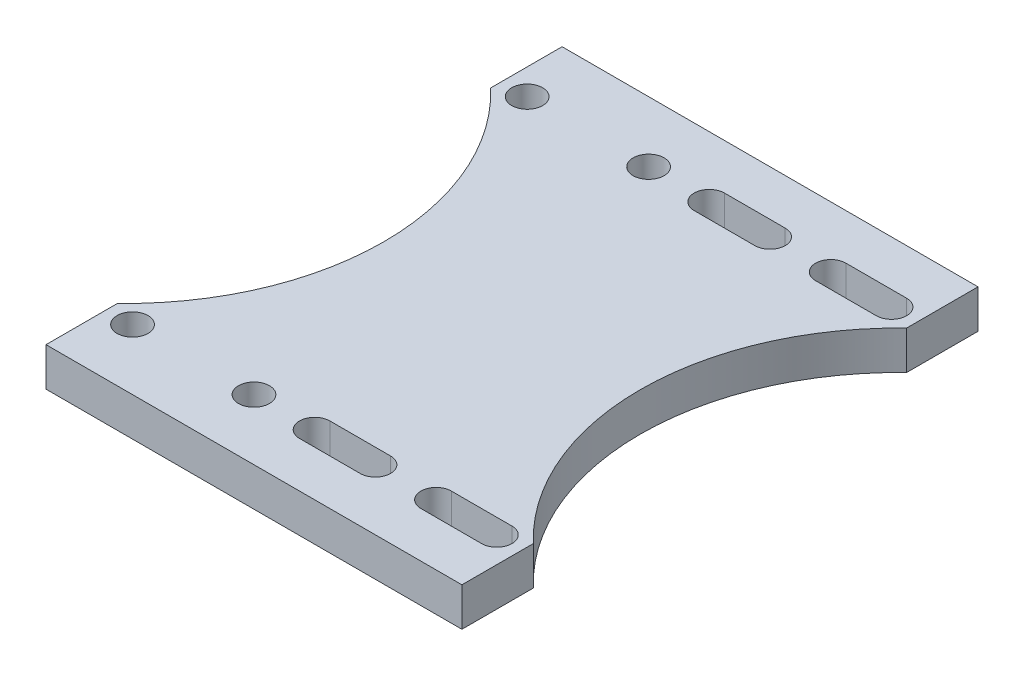
ISO-10303-21;
HEADER;
FILE_DESCRIPTION(('STEP AP214'),'2;1');
FILE_NAME('part.step','',(''),(''),'','','');
FILE_SCHEMA(('AUTOMOTIVE_DESIGN { 1 0 10303 214 1 1 1 1 }'));
ENDSEC;
DATA;
#1=APPLICATION_CONTEXT('core data for automotive mechanical design processes');
#2=APPLICATION_PROTOCOL_DEFINITION('international standard','automotive_design',2000,#1);
#3=PRODUCT_CONTEXT('',#1,'mechanical');
#4=PRODUCT('Part','Part','',(#3));
#5=PRODUCT_RELATED_PRODUCT_CATEGORY('part','',(#4));
#6=PRODUCT_DEFINITION_FORMATION('','',#4);
#7=PRODUCT_DEFINITION_CONTEXT('part definition',#1,'design');
#8=PRODUCT_DEFINITION('design','',#6,#7);
#9=PRODUCT_DEFINITION_SHAPE('','',#8);
#10=(LENGTH_UNIT() NAMED_UNIT(*) SI_UNIT(.MILLI.,.METRE.));
#11=(NAMED_UNIT(*) PLANE_ANGLE_UNIT() SI_UNIT($,.RADIAN.));
#12=(NAMED_UNIT(*) SI_UNIT($,.STERADIAN.) SOLID_ANGLE_UNIT());
#13=UNCERTAINTY_MEASURE_WITH_UNIT(LENGTH_MEASURE(1.E-05),#10,'distance_accuracy_value','');
#14=(GEOMETRIC_REPRESENTATION_CONTEXT(3) GLOBAL_UNCERTAINTY_ASSIGNED_CONTEXT((#13)) GLOBAL_UNIT_ASSIGNED_CONTEXT((#10,
#11,#12)) REPRESENTATION_CONTEXT('',''));
#15=CARTESIAN_POINT('',(0.,0.,0.));
#16=DIRECTION('',(0.,0.,1.));
#17=DIRECTION('',(1.,0.,0.));
#18=AXIS2_PLACEMENT_3D('',#15,#16,#17);
#19=CARTESIAN_POINT('',(33.5,-6.35,0.));
#20=DIRECTION('',(-1.,0.,0.));
#21=DIRECTION('',(0.,0.,1.));
#22=AXIS2_PLACEMENT_3D('',#19,#20,#21);
#23=PLANE('',#22);
#24=DIRECTION('',(0.,0.,1.));
#25=VECTOR('',#24,1.);
#26=CARTESIAN_POINT('',(33.5,0.,0.));
#27=LINE('',#26,#25);
#28=CARTESIAN_POINT('',(33.5,0.,30.7330373307572));
#29=VERTEX_POINT('',#28);
#30=CARTESIAN_POINT('',(33.5,0.,42.5));
#31=VERTEX_POINT('',#30);
#32=EDGE_CURVE('E281',#29,#31,#27,.T.);
#33=ORIENTED_EDGE('',*,*,#32,.T.);
#34=DIRECTION('',(0.,1.,0.));
#35=VECTOR('',#34,1.);
#36=CARTESIAN_POINT('',(33.5,-6.35,42.5));
#37=LINE('',#36,#35);
#38=CARTESIAN_POINT('',(33.5,-6.35,42.5));
#39=VERTEX_POINT('',#38);
#40=EDGE_CURVE('E11',#39,#31,#37,.T.);
#41=ORIENTED_EDGE('',*,*,#40,.F.);
#42=DIRECTION('',(0.,0.,1.));
#43=VECTOR('',#42,1.);
#44=CARTESIAN_POINT('',(33.5,-6.35,0.));
#45=LINE('',#44,#43);
#46=CARTESIAN_POINT('',(33.5,-6.35,30.7330373307572));
#47=VERTEX_POINT('',#46);
#48=EDGE_CURVE('E399',#47,#39,#45,.T.);
#49=ORIENTED_EDGE('',*,*,#48,.F.);
#50=DIRECTION('',(0.,1.,0.));
#51=VECTOR('',#50,1.);
#52=CARTESIAN_POINT('',(33.5,-6.35,30.7330373307572));
#53=LINE('',#52,#51);
#54=EDGE_CURVE('E309',#47,#29,#53,.T.);
#55=ORIENTED_EDGE('',*,*,#54,.T.);
#56=EDGE_LOOP('',(#33,#41,#49,#55));
#57=FACE_BOUND('',#56,.T.);
#58=ADVANCED_FACE('F35',(#57),#23,.F.);
#59=CARTESIAN_POINT('',(0.,-6.35,42.5));
#60=DIRECTION('',(0.,0.,-1.));
#61=DIRECTION('',(-1.,0.,0.));
#62=AXIS2_PLACEMENT_3D('',#59,#60,#61);
#63=PLANE('',#62);
#64=DIRECTION('',(-1.,0.,0.));
#65=VECTOR('',#64,1.);
#66=CARTESIAN_POINT('',(0.,0.,42.5));
#67=LINE('',#66,#65);
#68=CARTESIAN_POINT('',(-35.,0.,42.5));
#69=VERTEX_POINT('',#68);
#70=EDGE_CURVE('E135',#31,#69,#67,.T.);
#71=ORIENTED_EDGE('',*,*,#70,.T.);
#72=DIRECTION('',(0.,1.,0.));
#73=VECTOR('',#72,1.);
#74=CARTESIAN_POINT('',(-35.,-6.35,42.5));
#75=LINE('',#74,#73);
#76=CARTESIAN_POINT('',(-35.,-6.35,42.5));
#77=VERTEX_POINT('',#76);
#78=EDGE_CURVE('E45',#77,#69,#75,.T.);
#79=ORIENTED_EDGE('',*,*,#78,.F.);
#80=DIRECTION('',(-1.,0.,0.));
#81=VECTOR('',#80,1.);
#82=CARTESIAN_POINT('',(0.,-6.35,42.5));
#83=LINE('',#82,#81);
#84=EDGE_CURVE('E53',#39,#77,#83,.T.);
#85=ORIENTED_EDGE('',*,*,#84,.F.);
#86=ORIENTED_EDGE('',*,*,#40,.T.);
#87=EDGE_LOOP('',(#71,#79,#85,#86));
#88=FACE_BOUND('',#87,.T.);
#89=ADVANCED_FACE('F422',(#88),#63,.F.);
#90=CARTESIAN_POINT('',(-35.,-6.35,0.));
#91=DIRECTION('',(-1.,0.,0.));
#92=DIRECTION('',(0.,0.,1.));
#93=AXIS2_PLACEMENT_3D('',#90,#91,#92);
#94=PLANE('',#93);
#95=DIRECTION('',(0.,0.,1.));
#96=VECTOR('',#95,1.);
#97=CARTESIAN_POINT('',(-35.,0.,0.));
#98=LINE('',#97,#96);
#99=CARTESIAN_POINT('',(-35.,0.,30.7330373307572));
#100=VERTEX_POINT('',#99);
#101=EDGE_CURVE('E207',#100,#69,#98,.T.);
#102=ORIENTED_EDGE('',*,*,#101,.F.);
#103=DIRECTION('',(0.,1.,0.));
#104=VECTOR('',#103,1.);
#105=CARTESIAN_POINT('',(-35.,-6.35,30.7330373307572));
#106=LINE('',#105,#104);
#107=CARTESIAN_POINT('',(-35.,-6.35,30.7330373307572));
#108=VERTEX_POINT('',#107);
#109=EDGE_CURVE('E203',#108,#100,#106,.T.);
#110=ORIENTED_EDGE('',*,*,#109,.F.);
#111=DIRECTION('',(0.,0.,1.));
#112=VECTOR('',#111,1.);
#113=CARTESIAN_POINT('',(-35.,-6.35,0.));
#114=LINE('',#113,#112);
#115=EDGE_CURVE('E206',#108,#77,#114,.T.);
#116=ORIENTED_EDGE('',*,*,#115,.T.);
#117=ORIENTED_EDGE('',*,*,#78,.T.);
#118=EDGE_LOOP('',(#102,#110,#116,#117));
#119=FACE_BOUND('',#118,.T.);
#120=ADVANCED_FACE('F205',(#119),#94,.T.);
#121=CARTESIAN_POINT('',(-64.3552451263192,-6.35,0.));
#122=DIRECTION('',(0.,1.,0.));
#123=DIRECTION('',(0.,0.,1.));
#124=AXIS2_PLACEMENT_3D('',#121,#122,#123);
#125=CYLINDRICAL_SURFACE('',#124,42.5);
#126=CARTESIAN_POINT('',(-64.3552451263192,0.,0.));
#127=DIRECTION('',(0.,1.,0.));
#128=DIRECTION('',(0.,0.,1.));
#129=AXIS2_PLACEMENT_3D('',#126,#127,#128);
#130=CIRCLE('',#129,42.5);
#131=CARTESIAN_POINT('',(-35.,0.,-30.7330373307572));
#132=VERTEX_POINT('',#131);
#133=EDGE_CURVE('E295',#132,#100,#130,.F.);
#134=ORIENTED_EDGE('',*,*,#133,.F.);
#135=DIRECTION('',(0.,1.,0.));
#136=VECTOR('',#135,1.);
#137=CARTESIAN_POINT('',(-35.,-6.35,-30.7330373307572));
#138=LINE('',#137,#136);
#139=CARTESIAN_POINT('',(-35.,-6.35,-30.7330373307572));
#140=VERTEX_POINT('',#139);
#141=EDGE_CURVE('E212',#140,#132,#138,.T.);
#142=ORIENTED_EDGE('',*,*,#141,.F.);
#143=CARTESIAN_POINT('',(-64.3552451263192,-6.35,0.));
#144=DIRECTION('',(0.,1.,0.));
#145=DIRECTION('',(0.,0.,1.));
#146=AXIS2_PLACEMENT_3D('',#143,#144,#145);
#147=CIRCLE('',#146,42.5);
#148=EDGE_CURVE('E218',#140,#108,#147,.F.);
#149=ORIENTED_EDGE('',*,*,#148,.T.);
#150=ORIENTED_EDGE('',*,*,#109,.T.);
#151=EDGE_LOOP('',(#134,#142,#149,#150));
#152=FACE_BOUND('',#151,.T.);
#153=ADVANCED_FACE('F221',(#152),#125,.F.);
#154=CARTESIAN_POINT('',(-35.,-6.35,0.));
#155=DIRECTION('',(-1.,0.,0.));
#156=DIRECTION('',(0.,0.,1.));
#157=AXIS2_PLACEMENT_3D('',#154,#155,#156);
#158=PLANE('',#157);
#159=DIRECTION('',(0.,0.,1.));
#160=VECTOR('',#159,1.);
#161=CARTESIAN_POINT('',(-35.,0.,0.));
#162=LINE('',#161,#160);
#163=CARTESIAN_POINT('',(-35.,0.,-42.5));
#164=VERTEX_POINT('',#163);
#165=EDGE_CURVE('E292',#164,#132,#162,.T.);
#166=ORIENTED_EDGE('',*,*,#165,.F.);
#167=DIRECTION('',(0.,1.,0.));
#168=VECTOR('',#167,1.);
#169=CARTESIAN_POINT('',(-35.,-6.35,-42.5));
#170=LINE('',#169,#168);
#171=CARTESIAN_POINT('',(-35.,-6.35,-42.5));
#172=VERTEX_POINT('',#171);
#173=EDGE_CURVE('E302',#172,#164,#170,.T.);
#174=ORIENTED_EDGE('',*,*,#173,.F.);
#175=DIRECTION('',(0.,0.,1.));
#176=VECTOR('',#175,1.);
#177=CARTESIAN_POINT('',(-35.,-6.35,0.));
#178=LINE('',#177,#176);
#179=EDGE_CURVE('E222',#172,#140,#178,.T.);
#180=ORIENTED_EDGE('',*,*,#179,.T.);
#181=ORIENTED_EDGE('',*,*,#141,.T.);
#182=EDGE_LOOP('',(#166,#174,#180,#181));
#183=FACE_BOUND('',#182,.T.);
#184=ADVANCED_FACE('F425',(#183),#158,.T.);
#185=CARTESIAN_POINT('',(0.,-6.35,-42.5));
#186=DIRECTION('',(0.,0.,1.));
#187=DIRECTION('',(1.,0.,0.));
#188=AXIS2_PLACEMENT_3D('',#185,#186,#187);
#189=PLANE('',#188);
#190=DIRECTION('',(1.,0.,0.));
#191=VECTOR('',#190,1.);
#192=CARTESIAN_POINT('',(0.,0.,-42.5));
#193=LINE('',#192,#191);
#194=CARTESIAN_POINT('',(33.5,0.,-42.5));
#195=VERTEX_POINT('',#194);
#196=EDGE_CURVE('E290',#164,#195,#193,.T.);
#197=ORIENTED_EDGE('',*,*,#196,.T.);
#198=DIRECTION('',(0.,1.,0.));
#199=VECTOR('',#198,1.);
#200=CARTESIAN_POINT('',(33.5,-6.35,-42.5));
#201=LINE('',#200,#199);
#202=CARTESIAN_POINT('',(33.5,-6.35,-42.5));
#203=VERTEX_POINT('',#202);
#204=EDGE_CURVE('E304',#203,#195,#201,.T.);
#205=ORIENTED_EDGE('',*,*,#204,.F.);
#206=DIRECTION('',(1.,0.,0.));
#207=VECTOR('',#206,1.);
#208=CARTESIAN_POINT('',(0.,-6.35,-42.5));
#209=LINE('',#208,#207);
#210=EDGE_CURVE('E224',#172,#203,#209,.T.);
#211=ORIENTED_EDGE('',*,*,#210,.F.);
#212=ORIENTED_EDGE('',*,*,#173,.T.);
#213=EDGE_LOOP('',(#197,#205,#211,#212));
#214=FACE_BOUND('',#213,.T.);
#215=ADVANCED_FACE('F411',(#214),#189,.F.);
#216=CARTESIAN_POINT('',(33.5000000000001,-6.35,-1.31555097245209E-13));
#217=DIRECTION('',(-1.,0.,0.));
#218=DIRECTION('',(0.,0.,1.));
#219=AXIS2_PLACEMENT_3D('',#216,#217,#218);
#220=PLANE('',#219);
#221=DIRECTION('',(0.,0.,1.));
#222=VECTOR('',#221,1.);
#223=CARTESIAN_POINT('',(33.5000000000001,0.,-1.31555097245209E-13));
#224=LINE('',#223,#222);
#225=CARTESIAN_POINT('',(33.5,0.,-30.7330373307572));
#226=VERTEX_POINT('',#225);
#227=EDGE_CURVE('E287',#195,#226,#224,.T.);
#228=ORIENTED_EDGE('',*,*,#227,.T.);
#229=DIRECTION('',(0.,1.,0.));
#230=VECTOR('',#229,1.);
#231=CARTESIAN_POINT('',(33.5,-6.35,-30.7330373307572));
#232=LINE('',#231,#230);
#233=CARTESIAN_POINT('',(33.5,-6.35,-30.7330373307572));
#234=VERTEX_POINT('',#233);
#235=EDGE_CURVE('E307',#234,#226,#232,.T.);
#236=ORIENTED_EDGE('',*,*,#235,.F.);
#237=DIRECTION('',(0.,0.,1.));
#238=VECTOR('',#237,1.);
#239=CARTESIAN_POINT('',(33.5000000000001,-6.35,-1.31555097245209E-13));
#240=LINE('',#239,#238);
#241=EDGE_CURVE('E404',#203,#234,#240,.T.);
#242=ORIENTED_EDGE('',*,*,#241,.F.);
#243=ORIENTED_EDGE('',*,*,#204,.T.);
#244=EDGE_LOOP('',(#228,#236,#242,#243));
#245=FACE_BOUND('',#244,.T.);
#246=ADVANCED_FACE('F415',(#245),#220,.F.);
#247=CARTESIAN_POINT('',(-0.750000000000006,-6.35,-32.5));
#248=DIRECTION('',(0.,1.,0.));
#249=DIRECTION('',(0.,0.,1.));
#250=AXIS2_PLACEMENT_3D('',#247,#248,#249);
#251=CYLINDRICAL_SURFACE('',#250,2.5);
#252=CARTESIAN_POINT('',(-0.750000000000006,0.,-32.5));
#253=DIRECTION('',(0.,1.,0.));
#254=DIRECTION('',(0.,0.,1.));
#255=AXIS2_PLACEMENT_3D('',#252,#253,#254);
#256=CIRCLE('',#255,2.5);
#257=CARTESIAN_POINT('',(-0.750000000000007,0.,-35.));
#258=VERTEX_POINT('',#257);
#259=CARTESIAN_POINT('',(-0.750000000000006,0.,-30.));
#260=VERTEX_POINT('',#259);
#261=EDGE_CURVE('E271',#258,#260,#256,.T.);
#262=ORIENTED_EDGE('',*,*,#261,.T.);
#263=DIRECTION('',(0.,1.,0.));
#264=VECTOR('',#263,1.);
#265=CARTESIAN_POINT('',(-0.750000000000006,-6.35,-30.));
#266=LINE('',#265,#264);
#267=CARTESIAN_POINT('',(-0.750000000000006,-6.35,-30.));
#268=VERTEX_POINT('',#267);
#269=EDGE_CURVE('E311',#268,#260,#266,.T.);
#270=ORIENTED_EDGE('',*,*,#269,.F.);
#271=CARTESIAN_POINT('',(-0.750000000000006,-6.35,-32.5));
#272=DIRECTION('',(0.,1.,0.));
#273=DIRECTION('',(0.,0.,1.));
#274=AXIS2_PLACEMENT_3D('',#271,#272,#273);
#275=CIRCLE('',#274,2.5);
#276=CARTESIAN_POINT('',(-0.750000000000007,-6.35,-35.));
#277=VERTEX_POINT('',#276);
#278=EDGE_CURVE('E390',#277,#268,#275,.T.);
#279=ORIENTED_EDGE('',*,*,#278,.F.);
#280=DIRECTION('',(0.,1.,0.));
#281=VECTOR('',#280,1.);
#282=CARTESIAN_POINT('',(-0.750000000000007,-6.35,-35.));
#283=LINE('',#282,#281);
#284=EDGE_CURVE('E318',#277,#258,#283,.T.);
#285=ORIENTED_EDGE('',*,*,#284,.T.);
#286=EDGE_LOOP('',(#262,#270,#279,#285));
#287=FACE_BOUND('',#286,.T.);
#288=ADVANCED_FACE('F447',(#287),#251,.F.);
#289=CARTESIAN_POINT('',(0.,-6.35,-30.));
#290=DIRECTION('',(0.,0.,-1.));
#291=DIRECTION('',(-1.,0.,0.));
#292=AXIS2_PLACEMENT_3D('',#289,#290,#291);
#293=PLANE('',#292);
#294=DIRECTION('',(-1.,0.,0.));
#295=VECTOR('',#294,1.);
#296=CARTESIAN_POINT('',(0.,0.,-30.));
#297=LINE('',#296,#295);
#298=CARTESIAN_POINT('',(9.24999999999999,0.,-30.));
#299=VERTEX_POINT('',#298);
#300=EDGE_CURVE('E278',#299,#260,#297,.T.);
#301=ORIENTED_EDGE('',*,*,#300,.F.);
#302=DIRECTION('',(0.,1.,0.));
#303=VECTOR('',#302,1.);
#304=CARTESIAN_POINT('',(9.24999999999999,-6.35,-30.));
#305=LINE('',#304,#303);
#306=CARTESIAN_POINT('',(9.24999999999999,-6.35,-30.));
#307=VERTEX_POINT('',#306);
#308=EDGE_CURVE('E313',#307,#299,#305,.T.);
#309=ORIENTED_EDGE('',*,*,#308,.F.);
#310=DIRECTION('',(-1.,0.,0.));
#311=VECTOR('',#310,1.);
#312=CARTESIAN_POINT('',(0.,-6.35,-30.));
#313=LINE('',#312,#311);
#314=EDGE_CURVE('E396',#307,#268,#313,.T.);
#315=ORIENTED_EDGE('',*,*,#314,.T.);
#316=ORIENTED_EDGE('',*,*,#269,.T.);
#317=EDGE_LOOP('',(#301,#309,#315,#316));
#318=FACE_BOUND('',#317,.T.);
#319=ADVANCED_FACE('F443',(#318),#293,.T.);
#320=CARTESIAN_POINT('',(9.24999999999999,-6.35,-32.5));
#321=DIRECTION('',(0.,1.,0.));
#322=DIRECTION('',(0.,0.,1.));
#323=AXIS2_PLACEMENT_3D('',#320,#321,#322);
#324=CYLINDRICAL_SURFACE('',#323,2.5);
#325=CARTESIAN_POINT('',(9.24999999999999,0.,-32.5));
#326=DIRECTION('',(0.,1.,0.));
#327=DIRECTION('',(0.,0.,1.));
#328=AXIS2_PLACEMENT_3D('',#325,#326,#327);
#329=CIRCLE('',#328,2.5);
#330=CARTESIAN_POINT('',(9.24999999999999,0.,-35.));
#331=VERTEX_POINT('',#330);
#332=EDGE_CURVE('E276',#299,#331,#329,.T.);
#333=ORIENTED_EDGE('',*,*,#332,.T.);
#334=DIRECTION('',(0.,1.,0.));
#335=VECTOR('',#334,1.);
#336=CARTESIAN_POINT('',(9.24999999999999,-6.35,-35.));
#337=LINE('',#336,#335);
#338=CARTESIAN_POINT('',(9.24999999999999,-6.35,-35.));
#339=VERTEX_POINT('',#338);
#340=EDGE_CURVE('E315',#339,#331,#337,.T.);
#341=ORIENTED_EDGE('',*,*,#340,.F.);
#342=CARTESIAN_POINT('',(9.24999999999999,-6.35,-32.5));
#343=DIRECTION('',(0.,1.,0.));
#344=DIRECTION('',(0.,0.,1.));
#345=AXIS2_PLACEMENT_3D('',#342,#343,#344);
#346=CIRCLE('',#345,2.5);
#347=EDGE_CURVE('E394',#307,#339,#346,.T.);
#348=ORIENTED_EDGE('',*,*,#347,.F.);
#349=ORIENTED_EDGE('',*,*,#308,.T.);
#350=EDGE_LOOP('',(#333,#341,#348,#349));
#351=FACE_BOUND('',#350,.T.);
#352=ADVANCED_FACE('F446',(#351),#324,.F.);
#353=CARTESIAN_POINT('',(19.25,-6.35,-32.5));
#354=DIRECTION('',(0.,1.,0.));
#355=DIRECTION('',(0.,0.,1.));
#356=AXIS2_PLACEMENT_3D('',#353,#354,#355);
#357=CYLINDRICAL_SURFACE('',#356,2.5);
#358=CARTESIAN_POINT('',(19.25,0.,-32.5));
#359=DIRECTION('',(0.,1.,0.));
#360=DIRECTION('',(0.,0.,1.));
#361=AXIS2_PLACEMENT_3D('',#358,#359,#360);
#362=CIRCLE('',#361,2.5);
#363=CARTESIAN_POINT('',(19.25,0.,-35.));
#364=VERTEX_POINT('',#363);
#365=CARTESIAN_POINT('',(19.25,0.,-30.));
#366=VERTEX_POINT('',#365);
#367=EDGE_CURVE('E261',#364,#366,#362,.T.);
#368=ORIENTED_EDGE('',*,*,#367,.T.);
#369=DIRECTION('',(0.,1.,0.));
#370=VECTOR('',#369,1.);
#371=CARTESIAN_POINT('',(19.25,-6.35,-30.));
#372=LINE('',#371,#370);
#373=CARTESIAN_POINT('',(19.25,-6.35,-30.));
#374=VERTEX_POINT('',#373);
#375=EDGE_CURVE('E321',#374,#366,#372,.T.);
#376=ORIENTED_EDGE('',*,*,#375,.F.);
#377=CARTESIAN_POINT('',(19.25,-6.35,-32.5));
#378=DIRECTION('',(0.,1.,0.));
#379=DIRECTION('',(0.,0.,1.));
#380=AXIS2_PLACEMENT_3D('',#377,#378,#379);
#381=CIRCLE('',#380,2.5);
#382=CARTESIAN_POINT('',(19.25,-6.35,-35.));
#383=VERTEX_POINT('',#382);
#384=EDGE_CURVE('E381',#383,#374,#381,.T.);
#385=ORIENTED_EDGE('',*,*,#384,.F.);
#386=DIRECTION('',(0.,1.,0.));
#387=VECTOR('',#386,1.);
#388=CARTESIAN_POINT('',(19.25,-6.35,-35.));
#389=LINE('',#388,#387);
#390=EDGE_CURVE('E328',#383,#364,#389,.T.);
#391=ORIENTED_EDGE('',*,*,#390,.T.);
#392=EDGE_LOOP('',(#368,#376,#385,#391));
#393=FACE_BOUND('',#392,.T.);
#394=ADVANCED_FACE('F451',(#393),#357,.F.);
#395=CARTESIAN_POINT('',(0.,-6.35,-30.));
#396=DIRECTION('',(0.,0.,-1.));
#397=DIRECTION('',(-1.,0.,0.));
#398=AXIS2_PLACEMENT_3D('',#395,#396,#397);
#399=PLANE('',#398);
#400=DIRECTION('',(-1.,0.,0.));
#401=VECTOR('',#400,1.);
#402=CARTESIAN_POINT('',(0.,0.,-30.));
#403=LINE('',#402,#401);
#404=CARTESIAN_POINT('',(29.25,0.,-30.));
#405=VERTEX_POINT('',#404);
#406=EDGE_CURVE('E268',#405,#366,#403,.T.);
#407=ORIENTED_EDGE('',*,*,#406,.F.);
#408=DIRECTION('',(0.,1.,0.));
#409=VECTOR('',#408,1.);
#410=CARTESIAN_POINT('',(29.25,-6.35,-30.));
#411=LINE('',#410,#409);
#412=CARTESIAN_POINT('',(29.25,-6.35,-30.));
#413=VERTEX_POINT('',#412);
#414=EDGE_CURVE('E323',#413,#405,#411,.T.);
#415=ORIENTED_EDGE('',*,*,#414,.F.);
#416=DIRECTION('',(-1.,0.,0.));
#417=VECTOR('',#416,1.);
#418=CARTESIAN_POINT('',(0.,-6.35,-30.));
#419=LINE('',#418,#417);
#420=EDGE_CURVE('E387',#413,#374,#419,.T.);
#421=ORIENTED_EDGE('',*,*,#420,.T.);
#422=ORIENTED_EDGE('',*,*,#375,.T.);
#423=EDGE_LOOP('',(#407,#415,#421,#422));
#424=FACE_BOUND('',#423,.T.);
#425=ADVANCED_FACE('F462',(#424),#399,.T.);
#426=CARTESIAN_POINT('',(29.25,-6.35,-32.5));
#427=DIRECTION('',(0.,1.,0.));
#428=DIRECTION('',(0.,0.,1.));
#429=AXIS2_PLACEMENT_3D('',#426,#427,#428);
#430=CYLINDRICAL_SURFACE('',#429,2.5);
#431=CARTESIAN_POINT('',(29.25,0.,-32.5));
#432=DIRECTION('',(0.,1.,0.));
#433=DIRECTION('',(0.,0.,1.));
#434=AXIS2_PLACEMENT_3D('',#431,#432,#433);
#435=CIRCLE('',#434,2.5);
#436=CARTESIAN_POINT('',(29.25,0.,-35.));
#437=VERTEX_POINT('',#436);
#438=EDGE_CURVE('E266',#405,#437,#435,.T.);
#439=ORIENTED_EDGE('',*,*,#438,.T.);
#440=DIRECTION('',(0.,1.,0.));
#441=VECTOR('',#440,1.);
#442=CARTESIAN_POINT('',(29.25,-6.35,-35.));
#443=LINE('',#442,#441);
#444=CARTESIAN_POINT('',(29.25,-6.35,-35.));
#445=VERTEX_POINT('',#444);
#446=EDGE_CURVE('E325',#445,#437,#443,.T.);
#447=ORIENTED_EDGE('',*,*,#446,.F.);
#448=CARTESIAN_POINT('',(29.25,-6.35,-32.5));
#449=DIRECTION('',(0.,1.,0.));
#450=DIRECTION('',(0.,0.,1.));
#451=AXIS2_PLACEMENT_3D('',#448,#449,#450);
#452=CIRCLE('',#451,2.5);
#453=EDGE_CURVE('E385',#413,#445,#452,.T.);
#454=ORIENTED_EDGE('',*,*,#453,.F.);
#455=ORIENTED_EDGE('',*,*,#414,.T.);
#456=EDGE_LOOP('',(#439,#447,#454,#455));
#457=FACE_BOUND('',#456,.T.);
#458=ADVANCED_FACE('F465',(#457),#430,.F.);
#459=CARTESIAN_POINT('',(-0.749999999999997,-6.35,32.5));
#460=DIRECTION('',(0.,1.,0.));
#461=DIRECTION('',(0.,0.,1.));
#462=AXIS2_PLACEMENT_3D('',#459,#460,#461);
#463=CYLINDRICAL_SURFACE('',#462,2.50000000000001);
#464=CARTESIAN_POINT('',(-0.749999999999997,0.,32.5));
#465=DIRECTION('',(0.,1.,0.));
#466=DIRECTION('',(0.,0.,1.));
#467=AXIS2_PLACEMENT_3D('',#464,#465,#466);
#468=CIRCLE('',#467,2.50000000000001);
#469=CARTESIAN_POINT('',(-0.749999999999998,0.,30.));
#470=VERTEX_POINT('',#469);
#471=CARTESIAN_POINT('',(-0.749999999999997,0.,35.));
#472=VERTEX_POINT('',#471);
#473=EDGE_CURVE('E251',#470,#472,#468,.T.);
#474=ORIENTED_EDGE('',*,*,#473,.T.);
#475=DIRECTION('',(0.,1.,0.));
#476=VECTOR('',#475,1.);
#477=CARTESIAN_POINT('',(-0.749999999999997,-6.35,35.));
#478=LINE('',#477,#476);
#479=CARTESIAN_POINT('',(-0.749999999999997,-6.35,35.));
#480=VERTEX_POINT('',#479);
#481=EDGE_CURVE('E331',#480,#472,#478,.T.);
#482=ORIENTED_EDGE('',*,*,#481,.F.);
#483=CARTESIAN_POINT('',(-0.749999999999997,-6.35,32.5));
#484=DIRECTION('',(0.,1.,0.));
#485=DIRECTION('',(0.,0.,1.));
#486=AXIS2_PLACEMENT_3D('',#483,#484,#485);
#487=CIRCLE('',#486,2.50000000000001);
#488=CARTESIAN_POINT('',(-0.749999999999998,-6.35,30.));
#489=VERTEX_POINT('',#488);
#490=EDGE_CURVE('E367',#489,#480,#487,.T.);
#491=ORIENTED_EDGE('',*,*,#490,.F.);
#492=DIRECTION('',(0.,1.,0.));
#493=VECTOR('',#492,1.);
#494=CARTESIAN_POINT('',(-0.749999999999998,-6.35,30.));
#495=LINE('',#494,#493);
#496=EDGE_CURVE('E338',#489,#470,#495,.T.);
#497=ORIENTED_EDGE('',*,*,#496,.T.);
#498=EDGE_LOOP('',(#474,#482,#491,#497));
#499=FACE_BOUND('',#498,.T.);
#500=ADVANCED_FACE('F469',(#499),#463,.F.);
#501=CARTESIAN_POINT('',(0.,-6.35,35.));
#502=DIRECTION('',(0.,0.,-1.));
#503=DIRECTION('',(-1.,0.,0.));
#504=AXIS2_PLACEMENT_3D('',#501,#502,#503);
#505=PLANE('',#504);
#506=DIRECTION('',(-1.,0.,0.));
#507=VECTOR('',#506,1.);
#508=CARTESIAN_POINT('',(0.,0.,35.));
#509=LINE('',#508,#507);
#510=CARTESIAN_POINT('',(9.25,0.,35.));
#511=VERTEX_POINT('',#510);
#512=EDGE_CURVE('E258',#511,#472,#509,.T.);
#513=ORIENTED_EDGE('',*,*,#512,.F.);
#514=DIRECTION('',(0.,1.,0.));
#515=VECTOR('',#514,1.);
#516=CARTESIAN_POINT('',(9.25,-6.35,35.));
#517=LINE('',#516,#515);
#518=CARTESIAN_POINT('',(9.25,-6.35,35.));
#519=VERTEX_POINT('',#518);
#520=EDGE_CURVE('E333',#519,#511,#517,.T.);
#521=ORIENTED_EDGE('',*,*,#520,.F.);
#522=DIRECTION('',(-1.,0.,0.));
#523=VECTOR('',#522,1.);
#524=CARTESIAN_POINT('',(0.,-6.35,35.));
#525=LINE('',#524,#523);
#526=EDGE_CURVE('E378',#519,#480,#525,.T.);
#527=ORIENTED_EDGE('',*,*,#526,.T.);
#528=ORIENTED_EDGE('',*,*,#481,.T.);
#529=EDGE_LOOP('',(#513,#521,#527,#528));
#530=FACE_BOUND('',#529,.T.);
#531=ADVANCED_FACE('F478',(#530),#505,.T.);
#532=CARTESIAN_POINT('',(9.25,-6.35,32.5));
#533=DIRECTION('',(0.,1.,0.));
#534=DIRECTION('',(0.,0.,1.));
#535=AXIS2_PLACEMENT_3D('',#532,#533,#534);
#536=CYLINDRICAL_SURFACE('',#535,2.5);
#537=CARTESIAN_POINT('',(9.25,0.,32.5));
#538=DIRECTION('',(0.,1.,0.));
#539=DIRECTION('',(0.,0.,1.));
#540=AXIS2_PLACEMENT_3D('',#537,#538,#539);
#541=CIRCLE('',#540,2.5);
#542=CARTESIAN_POINT('',(9.25,0.,30.));
#543=VERTEX_POINT('',#542);
#544=EDGE_CURVE('E256',#511,#543,#541,.T.);
#545=ORIENTED_EDGE('',*,*,#544,.T.);
#546=DIRECTION('',(0.,1.,0.));
#547=VECTOR('',#546,1.);
#548=CARTESIAN_POINT('',(9.25,-6.35,30.));
#549=LINE('',#548,#547);
#550=CARTESIAN_POINT('',(9.25,-6.35,30.));
#551=VERTEX_POINT('',#550);
#552=EDGE_CURVE('E335',#551,#543,#549,.T.);
#553=ORIENTED_EDGE('',*,*,#552,.F.);
#554=CARTESIAN_POINT('',(9.25,-6.35,32.5));
#555=DIRECTION('',(0.,1.,0.));
#556=DIRECTION('',(0.,0.,1.));
#557=AXIS2_PLACEMENT_3D('',#554,#555,#556);
#558=CIRCLE('',#557,2.5);
#559=EDGE_CURVE('E376',#519,#551,#558,.T.);
#560=ORIENTED_EDGE('',*,*,#559,.F.);
#561=ORIENTED_EDGE('',*,*,#520,.T.);
#562=EDGE_LOOP('',(#545,#553,#560,#561));
#563=FACE_BOUND('',#562,.T.);
#564=ADVANCED_FACE('F481',(#563),#536,.F.);
#565=CARTESIAN_POINT('',(19.25,-6.35,32.5));
#566=DIRECTION('',(0.,1.,0.));
#567=DIRECTION('',(0.,0.,1.));
#568=AXIS2_PLACEMENT_3D('',#565,#566,#567);
#569=CYLINDRICAL_SURFACE('',#568,2.49999999999999);
#570=CARTESIAN_POINT('',(19.25,0.,32.5));
#571=DIRECTION('',(0.,1.,0.));
#572=DIRECTION('',(0.,0.,1.));
#573=AXIS2_PLACEMENT_3D('',#570,#571,#572);
#574=CIRCLE('',#573,2.49999999999999);
#575=CARTESIAN_POINT('',(19.25,0.,30.));
#576=VERTEX_POINT('',#575);
#577=CARTESIAN_POINT('',(19.25,0.,35.));
#578=VERTEX_POINT('',#577);
#579=EDGE_CURVE('E241',#576,#578,#574,.T.);
#580=ORIENTED_EDGE('',*,*,#579,.T.);
#581=DIRECTION('',(0.,1.,0.));
#582=VECTOR('',#581,1.);
#583=CARTESIAN_POINT('',(19.25,-6.35,35.));
#584=LINE('',#583,#582);
#585=CARTESIAN_POINT('',(19.25,-6.35,35.));
#586=VERTEX_POINT('',#585);
#587=EDGE_CURVE('E341',#586,#578,#584,.T.);
#588=ORIENTED_EDGE('',*,*,#587,.F.);
#589=CARTESIAN_POINT('',(19.25,-6.35,32.5));
#590=DIRECTION('',(0.,1.,0.));
#591=DIRECTION('',(0.,0.,1.));
#592=AXIS2_PLACEMENT_3D('',#589,#590,#591);
#593=CIRCLE('',#592,2.49999999999999);
#594=CARTESIAN_POINT('',(19.25,-6.35,30.));
#595=VERTEX_POINT('',#594);
#596=EDGE_CURVE('E355',#595,#586,#593,.T.);
#597=ORIENTED_EDGE('',*,*,#596,.F.);
#598=DIRECTION('',(0.,1.,0.));
#599=VECTOR('',#598,1.);
#600=CARTESIAN_POINT('',(19.25,-6.35,30.));
#601=LINE('',#600,#599);
#602=EDGE_CURVE('E39',#595,#576,#601,.T.);
#603=ORIENTED_EDGE('',*,*,#602,.T.);
#604=EDGE_LOOP('',(#580,#588,#597,#603));
#605=FACE_BOUND('',#604,.T.);
#606=ADVANCED_FACE('F353',(#605),#569,.F.);
#607=CARTESIAN_POINT('',(0.,-6.35,35.));
#608=DIRECTION('',(0.,0.,-1.));
#609=DIRECTION('',(-1.,0.,0.));
#610=AXIS2_PLACEMENT_3D('',#607,#608,#609);
#611=PLANE('',#610);
#612=DIRECTION('',(-1.,0.,0.));
#613=VECTOR('',#612,1.);
#614=CARTESIAN_POINT('',(0.,0.,35.));
#615=LINE('',#614,#613);
#616=CARTESIAN_POINT('',(29.25,0.,35.));
#617=VERTEX_POINT('',#616);
#618=EDGE_CURVE('E248',#617,#578,#615,.T.);
#619=ORIENTED_EDGE('',*,*,#618,.F.);
#620=DIRECTION('',(0.,1.,0.));
#621=VECTOR('',#620,1.);
#622=CARTESIAN_POINT('',(29.25,-6.35,35.));
#623=LINE('',#622,#621);
#624=CARTESIAN_POINT('',(29.25,-6.35,35.));
#625=VERTEX_POINT('',#624);
#626=EDGE_CURVE('E343',#625,#617,#623,.T.);
#627=ORIENTED_EDGE('',*,*,#626,.F.);
#628=DIRECTION('',(-1.,0.,0.));
#629=VECTOR('',#628,1.);
#630=CARTESIAN_POINT('',(0.,-6.35,35.));
#631=LINE('',#630,#629);
#632=EDGE_CURVE('E366',#625,#586,#631,.T.);
#633=ORIENTED_EDGE('',*,*,#632,.T.);
#634=ORIENTED_EDGE('',*,*,#587,.T.);
#635=EDGE_LOOP('',(#619,#627,#633,#634));
#636=FACE_BOUND('',#635,.T.);
#637=ADVANCED_FACE('F362',(#636),#611,.T.);
#638=CARTESIAN_POINT('',(29.25,-6.35,32.5));
#639=DIRECTION('',(0.,1.,0.));
#640=DIRECTION('',(0.,0.,1.));
#641=AXIS2_PLACEMENT_3D('',#638,#639,#640);
#642=CYLINDRICAL_SURFACE('',#641,2.5);
#643=CARTESIAN_POINT('',(29.25,0.,32.5));
#644=DIRECTION('',(0.,1.,0.));
#645=DIRECTION('',(0.,0.,1.));
#646=AXIS2_PLACEMENT_3D('',#643,#644,#645);
#647=CIRCLE('',#646,2.5);
#648=CARTESIAN_POINT('',(29.25,0.,30.));
#649=VERTEX_POINT('',#648);
#650=EDGE_CURVE('E246',#617,#649,#647,.T.);
#651=ORIENTED_EDGE('',*,*,#650,.T.);
#652=DIRECTION('',(0.,1.,0.));
#653=VECTOR('',#652,1.);
#654=CARTESIAN_POINT('',(29.25,-6.35,30.));
#655=LINE('',#654,#653);
#656=CARTESIAN_POINT('',(29.25,-6.35,30.));
#657=VERTEX_POINT('',#656);
#658=EDGE_CURVE('E344',#657,#649,#655,.T.);
#659=ORIENTED_EDGE('',*,*,#658,.F.);
#660=CARTESIAN_POINT('',(29.25,-6.35,32.5));
#661=DIRECTION('',(0.,1.,0.));
#662=DIRECTION('',(0.,0.,1.));
#663=AXIS2_PLACEMENT_3D('',#660,#661,#662);
#664=CIRCLE('',#663,2.5);
#665=EDGE_CURVE('E368',#625,#657,#664,.T.);
#666=ORIENTED_EDGE('',*,*,#665,.F.);
#667=ORIENTED_EDGE('',*,*,#626,.T.);
#668=EDGE_LOOP('',(#651,#659,#666,#667));
#669=FACE_BOUND('',#668,.T.);
#670=ADVANCED_FACE('F457',(#669),#642,.F.);
#671=CARTESIAN_POINT('',(0.,-6.35,-35.));
#672=DIRECTION('',(0.,0.,-1.));
#673=DIRECTION('',(-1.,0.,0.));
#674=AXIS2_PLACEMENT_3D('',#671,#672,#673);
#675=PLANE('',#674);
#676=DIRECTION('',(-1.,0.,0.));
#677=VECTOR('',#676,1.);
#678=CARTESIAN_POINT('',(0.,0.,-35.));
#679=LINE('',#678,#677);
#680=EDGE_CURVE('E274',#331,#258,#679,.T.);
#681=ORIENTED_EDGE('',*,*,#680,.T.);
#682=ORIENTED_EDGE('',*,*,#284,.F.);
#683=DIRECTION('',(-1.,0.,0.));
#684=VECTOR('',#683,1.);
#685=CARTESIAN_POINT('',(0.,-6.35,-35.));
#686=LINE('',#685,#684);
#687=EDGE_CURVE('E392',#339,#277,#686,.T.);
#688=ORIENTED_EDGE('',*,*,#687,.F.);
#689=ORIENTED_EDGE('',*,*,#340,.T.);
#690=EDGE_LOOP('',(#681,#682,#688,#689));
#691=FACE_BOUND('',#690,.T.);
#692=ADVANCED_FACE('F453',(#691),#675,.F.);
#693=CARTESIAN_POINT('',(0.,-6.35,-35.));
#694=DIRECTION('',(0.,0.,-1.));
#695=DIRECTION('',(-1.,0.,0.));
#696=AXIS2_PLACEMENT_3D('',#693,#694,#695);
#697=PLANE('',#696);
#698=DIRECTION('',(-1.,0.,0.));
#699=VECTOR('',#698,1.);
#700=CARTESIAN_POINT('',(0.,0.,-35.));
#701=LINE('',#700,#699);
#702=EDGE_CURVE('E264',#437,#364,#701,.T.);
#703=ORIENTED_EDGE('',*,*,#702,.T.);
#704=ORIENTED_EDGE('',*,*,#390,.F.);
#705=DIRECTION('',(-1.,0.,0.));
#706=VECTOR('',#705,1.);
#707=CARTESIAN_POINT('',(0.,-6.35,-35.));
#708=LINE('',#707,#706);
#709=EDGE_CURVE('E383',#445,#383,#708,.T.);
#710=ORIENTED_EDGE('',*,*,#709,.F.);
#711=ORIENTED_EDGE('',*,*,#446,.T.);
#712=EDGE_LOOP('',(#703,#704,#710,#711));
#713=FACE_BOUND('',#712,.T.);
#714=ADVANCED_FACE('F456',(#713),#697,.F.);
#715=CARTESIAN_POINT('',(0.,-6.35,30.));
#716=DIRECTION('',(0.,0.,-1.));
#717=DIRECTION('',(-1.,0.,0.));
#718=AXIS2_PLACEMENT_3D('',#715,#716,#717);
#719=PLANE('',#718);
#720=DIRECTION('',(-1.,0.,0.));
#721=VECTOR('',#720,1.);
#722=CARTESIAN_POINT('',(0.,0.,30.));
#723=LINE('',#722,#721);
#724=EDGE_CURVE('E254',#543,#470,#723,.T.);
#725=ORIENTED_EDGE('',*,*,#724,.T.);
#726=ORIENTED_EDGE('',*,*,#496,.F.);
#727=DIRECTION('',(-1.,0.,0.));
#728=VECTOR('',#727,1.);
#729=CARTESIAN_POINT('',(0.,-6.35,30.));
#730=LINE('',#729,#728);
#731=EDGE_CURVE('E370',#551,#489,#730,.T.);
#732=ORIENTED_EDGE('',*,*,#731,.F.);
#733=ORIENTED_EDGE('',*,*,#552,.T.);
#734=EDGE_LOOP('',(#725,#726,#732,#733));
#735=FACE_BOUND('',#734,.T.);
#736=ADVANCED_FACE('F473',(#735),#719,.F.);
#737=CARTESIAN_POINT('',(0.,-6.35,30.));
#738=DIRECTION('',(0.,0.,-1.));
#739=DIRECTION('',(-1.,0.,0.));
#740=AXIS2_PLACEMENT_3D('',#737,#738,#739);
#741=PLANE('',#740);
#742=DIRECTION('',(-1.,0.,0.));
#743=VECTOR('',#742,1.);
#744=CARTESIAN_POINT('',(0.,0.,30.));
#745=LINE('',#744,#743);
#746=EDGE_CURVE('E244',#649,#576,#745,.T.);
#747=ORIENTED_EDGE('',*,*,#746,.T.);
#748=ORIENTED_EDGE('',*,*,#602,.F.);
#749=DIRECTION('',(-1.,0.,0.));
#750=VECTOR('',#749,1.);
#751=CARTESIAN_POINT('',(0.,-6.35,30.));
#752=LINE('',#751,#750);
#753=EDGE_CURVE('E143',#657,#595,#752,.T.);
#754=ORIENTED_EDGE('',*,*,#753,.F.);
#755=ORIENTED_EDGE('',*,*,#658,.T.);
#756=EDGE_LOOP('',(#747,#748,#754,#755));
#757=FACE_BOUND('',#756,.T.);
#758=ADVANCED_FACE('F488',(#757),#741,.F.);
#759=CARTESIAN_POINT('',(-10.75,-6.35,32.5));
#760=DIRECTION('',(0.,1.,0.));
#761=DIRECTION('',(0.,0.,1.));
#762=AXIS2_PLACEMENT_3D('',#759,#760,#761);
#763=CYLINDRICAL_SURFACE('',#762,2.55);
#764=CARTESIAN_POINT('',(-10.75,-6.35,32.5));
#765=DIRECTION('',(0.,1.,0.));
#766=DIRECTION('',(0.,0.,1.));
#767=AXIS2_PLACEMENT_3D('',#764,#765,#766);
#768=CIRCLE('',#767,2.55);
#769=CARTESIAN_POINT('',(-10.75,-6.35,35.05));
#770=VERTEX_POINT('',#769);
#771=EDGE_CURVE('E736',#770,#770,#768,.T.);
#772=ORIENTED_EDGE('',*,*,#771,.F.);
#773=EDGE_LOOP('',(#772));
#774=FACE_BOUND('',#773,.T.);
#775=CARTESIAN_POINT('',(-10.75,0.,32.5));
#776=DIRECTION('',(0.,1.,0.));
#777=DIRECTION('',(0.,0.,1.));
#778=AXIS2_PLACEMENT_3D('',#775,#776,#777);
#779=CIRCLE('',#778,2.55);
#780=CARTESIAN_POINT('',(-10.75,0.,35.05));
#781=VERTEX_POINT('',#780);
#782=EDGE_CURVE('E238',#781,#781,#779,.T.);
#783=ORIENTED_EDGE('',*,*,#782,.T.);
#784=EDGE_LOOP('',(#783));
#785=FACE_BOUND('',#784,.T.);
#786=ADVANCED_FACE('F500',(#774,#785),#763,.F.);
#787=CARTESIAN_POINT('',(-10.75,-6.35,-32.5));
#788=DIRECTION('',(0.,1.,0.));
#789=DIRECTION('',(0.,0.,1.));
#790=AXIS2_PLACEMENT_3D('',#787,#788,#789);
#791=CYLINDRICAL_SURFACE('',#790,2.55);
#792=CARTESIAN_POINT('',(-10.75,-6.35,-32.5));
#793=DIRECTION('',(0.,1.,0.));
#794=DIRECTION('',(0.,0.,1.));
#795=AXIS2_PLACEMENT_3D('',#792,#793,#794);
#796=CIRCLE('',#795,2.55);
#797=CARTESIAN_POINT('',(-10.75,-6.35,-29.95));
#798=VERTEX_POINT('',#797);
#799=EDGE_CURVE('E733',#798,#798,#796,.T.);
#800=ORIENTED_EDGE('',*,*,#799,.F.);
#801=EDGE_LOOP('',(#800));
#802=FACE_BOUND('',#801,.T.);
#803=CARTESIAN_POINT('',(-10.75,0.,-32.5));
#804=DIRECTION('',(0.,1.,0.));
#805=DIRECTION('',(0.,0.,1.));
#806=AXIS2_PLACEMENT_3D('',#803,#804,#805);
#807=CIRCLE('',#806,2.55);
#808=CARTESIAN_POINT('',(-10.75,0.,-29.95));
#809=VERTEX_POINT('',#808);
#810=EDGE_CURVE('E235',#809,#809,#807,.T.);
#811=ORIENTED_EDGE('',*,*,#810,.T.);
#812=EDGE_LOOP('',(#811));
#813=FACE_BOUND('',#812,.T.);
#814=ADVANCED_FACE('F505',(#802,#813),#791,.F.);
#815=CARTESIAN_POINT('',(-30.75,-6.35,-32.5));
#816=DIRECTION('',(0.,1.,0.));
#817=DIRECTION('',(0.,0.,1.));
#818=AXIS2_PLACEMENT_3D('',#815,#816,#817);
#819=CYLINDRICAL_SURFACE('',#818,2.55000000000001);
#820=CARTESIAN_POINT('',(-30.75,-6.35,-32.5));
#821=DIRECTION('',(0.,1.,0.));
#822=DIRECTION('',(0.,0.,1.));
#823=AXIS2_PLACEMENT_3D('',#820,#821,#822);
#824=CIRCLE('',#823,2.55000000000001);
#825=CARTESIAN_POINT('',(-30.75,-6.35,-29.95));
#826=VERTEX_POINT('',#825);
#827=EDGE_CURVE('E519',#826,#826,#824,.T.);
#828=ORIENTED_EDGE('',*,*,#827,.F.);
#829=EDGE_LOOP('',(#828));
#830=FACE_BOUND('',#829,.T.);
#831=CARTESIAN_POINT('',(-30.75,0.,-32.5));
#832=DIRECTION('',(0.,1.,0.));
#833=DIRECTION('',(0.,0.,1.));
#834=AXIS2_PLACEMENT_3D('',#831,#832,#833);
#835=CIRCLE('',#834,2.55000000000001);
#836=CARTESIAN_POINT('',(-30.75,0.,-29.95));
#837=VERTEX_POINT('',#836);
#838=EDGE_CURVE('E232',#837,#837,#835,.T.);
#839=ORIENTED_EDGE('',*,*,#838,.T.);
#840=EDGE_LOOP('',(#839));
#841=FACE_BOUND('',#840,.T.);
#842=ADVANCED_FACE('F508',(#830,#841),#819,.F.);
#843=CARTESIAN_POINT('',(-30.75,-6.35,32.5));
#844=DIRECTION('',(0.,1.,0.));
#845=DIRECTION('',(0.,0.,1.));
#846=AXIS2_PLACEMENT_3D('',#843,#844,#845);
#847=CYLINDRICAL_SURFACE('',#846,2.55000000000001);
#848=CARTESIAN_POINT('',(-30.75,-6.35,32.5));
#849=DIRECTION('',(0.,1.,0.));
#850=DIRECTION('',(0.,0.,1.));
#851=AXIS2_PLACEMENT_3D('',#848,#849,#850);
#852=CIRCLE('',#851,2.55000000000001);
#853=CARTESIAN_POINT('',(-30.75,-6.35,35.05));
#854=VERTEX_POINT('',#853);
#855=EDGE_CURVE('E298',#854,#854,#852,.T.);
#856=ORIENTED_EDGE('',*,*,#855,.F.);
#857=EDGE_LOOP('',(#856));
#858=FACE_BOUND('',#857,.T.);
#859=CARTESIAN_POINT('',(-30.75,0.,32.5));
#860=DIRECTION('',(0.,1.,0.));
#861=DIRECTION('',(0.,0.,1.));
#862=AXIS2_PLACEMENT_3D('',#859,#860,#861);
#863=CIRCLE('',#862,2.55000000000001);
#864=CARTESIAN_POINT('',(-30.75,0.,35.05));
#865=VERTEX_POINT('',#864);
#866=EDGE_CURVE('E229',#865,#865,#863,.T.);
#867=ORIENTED_EDGE('',*,*,#866,.T.);
#868=EDGE_LOOP('',(#867));
#869=FACE_BOUND('',#868,.T.);
#870=ADVANCED_FACE('F37',(#858,#869),#847,.F.);
#871=CARTESIAN_POINT('',(62.8552451263192,-6.35,0.));
#872=DIRECTION('',(0.,1.,0.));
#873=DIRECTION('',(0.,0.,1.));
#874=AXIS2_PLACEMENT_3D('',#871,#872,#873);
#875=CYLINDRICAL_SURFACE('',#874,42.5);
#876=CARTESIAN_POINT('',(62.8552451263192,0.,0.));
#877=DIRECTION('',(0.,1.,0.));
#878=DIRECTION('',(0.,0.,1.));
#879=AXIS2_PLACEMENT_3D('',#876,#877,#878);
#880=CIRCLE('',#879,42.5);
#881=EDGE_CURVE('E284',#29,#226,#880,.F.);
#882=ORIENTED_EDGE('',*,*,#881,.F.);
#883=ORIENTED_EDGE('',*,*,#54,.F.);
#884=CARTESIAN_POINT('',(62.8552451263192,-6.35,0.));
#885=DIRECTION('',(0.,1.,0.));
#886=DIRECTION('',(0.,0.,1.));
#887=AXIS2_PLACEMENT_3D('',#884,#885,#886);
#888=CIRCLE('',#887,42.5);
#889=EDGE_CURVE('E401',#47,#234,#888,.F.);
#890=ORIENTED_EDGE('',*,*,#889,.T.);
#891=ORIENTED_EDGE('',*,*,#235,.T.);
#892=EDGE_LOOP('',(#882,#883,#890,#891));
#893=FACE_BOUND('',#892,.T.);
#894=ADVANCED_FACE('F418',(#893),#875,.F.);
#895=CARTESIAN_POINT('',(0.,-6.35,0.));
#896=DIRECTION('',(0.,1.,0.));
#897=DIRECTION('',(0.,0.,1.));
#898=AXIS2_PLACEMENT_3D('',#895,#896,#897);
#899=PLANE('',#898);
#900=ORIENTED_EDGE('',*,*,#855,.T.);
#901=EDGE_LOOP('',(#900));
#902=FACE_BOUND('',#901,.T.);
#903=ORIENTED_EDGE('',*,*,#827,.T.);
#904=EDGE_LOOP('',(#903));
#905=FACE_BOUND('',#904,.T.);
#906=ORIENTED_EDGE('',*,*,#799,.T.);
#907=EDGE_LOOP('',(#906));
#908=FACE_BOUND('',#907,.T.);
#909=ORIENTED_EDGE('',*,*,#771,.T.);
#910=EDGE_LOOP('',(#909));
#911=FACE_BOUND('',#910,.T.);
#912=ORIENTED_EDGE('',*,*,#596,.T.);
#913=ORIENTED_EDGE('',*,*,#632,.F.);
#914=ORIENTED_EDGE('',*,*,#665,.T.);
#915=ORIENTED_EDGE('',*,*,#753,.T.);
#916=EDGE_LOOP('',(#912,#913,#914,#915));
#917=FACE_BOUND('',#916,.T.);
#918=ORIENTED_EDGE('',*,*,#490,.T.);
#919=ORIENTED_EDGE('',*,*,#526,.F.);
#920=ORIENTED_EDGE('',*,*,#559,.T.);
#921=ORIENTED_EDGE('',*,*,#731,.T.);
#922=EDGE_LOOP('',(#918,#919,#920,#921));
#923=FACE_BOUND('',#922,.T.);
#924=ORIENTED_EDGE('',*,*,#384,.T.);
#925=ORIENTED_EDGE('',*,*,#420,.F.);
#926=ORIENTED_EDGE('',*,*,#453,.T.);
#927=ORIENTED_EDGE('',*,*,#709,.T.);
#928=EDGE_LOOP('',(#924,#925,#926,#927));
#929=FACE_BOUND('',#928,.T.);
#930=ORIENTED_EDGE('',*,*,#278,.T.);
#931=ORIENTED_EDGE('',*,*,#314,.F.);
#932=ORIENTED_EDGE('',*,*,#347,.T.);
#933=ORIENTED_EDGE('',*,*,#687,.T.);
#934=EDGE_LOOP('',(#930,#931,#932,#933));
#935=FACE_BOUND('',#934,.T.);
#936=ORIENTED_EDGE('',*,*,#48,.T.);
#937=ORIENTED_EDGE('',*,*,#84,.T.);
#938=ORIENTED_EDGE('',*,*,#115,.F.);
#939=ORIENTED_EDGE('',*,*,#148,.F.);
#940=ORIENTED_EDGE('',*,*,#179,.F.);
#941=ORIENTED_EDGE('',*,*,#210,.T.);
#942=ORIENTED_EDGE('',*,*,#241,.T.);
#943=ORIENTED_EDGE('',*,*,#889,.F.);
#944=EDGE_LOOP('',(#936,#937,#938,#939,#940,#941,#942,#943));
#945=FACE_BOUND('',#944,.T.);
#946=ADVANCED_FACE('F216',(#902,#905,#908,#911,#917,#923,#929,#935,#945),#899,.F.);
#947=CARTESIAN_POINT('',(0.,0.,0.));
#948=DIRECTION('',(0.,1.,0.));
#949=DIRECTION('',(0.,0.,1.));
#950=AXIS2_PLACEMENT_3D('',#947,#948,#949);
#951=PLANE('',#950);
#952=ORIENTED_EDGE('',*,*,#866,.F.);
#953=EDGE_LOOP('',(#952));
#954=FACE_BOUND('',#953,.T.);
#955=ORIENTED_EDGE('',*,*,#838,.F.);
#956=EDGE_LOOP('',(#955));
#957=FACE_BOUND('',#956,.T.);
#958=ORIENTED_EDGE('',*,*,#810,.F.);
#959=EDGE_LOOP('',(#958));
#960=FACE_BOUND('',#959,.T.);
#961=ORIENTED_EDGE('',*,*,#782,.F.);
#962=EDGE_LOOP('',(#961));
#963=FACE_BOUND('',#962,.T.);
#964=ORIENTED_EDGE('',*,*,#579,.F.);
#965=ORIENTED_EDGE('',*,*,#746,.F.);
#966=ORIENTED_EDGE('',*,*,#650,.F.);
#967=ORIENTED_EDGE('',*,*,#618,.T.);
#968=EDGE_LOOP('',(#964,#965,#966,#967));
#969=FACE_BOUND('',#968,.T.);
#970=ORIENTED_EDGE('',*,*,#473,.F.);
#971=ORIENTED_EDGE('',*,*,#724,.F.);
#972=ORIENTED_EDGE('',*,*,#544,.F.);
#973=ORIENTED_EDGE('',*,*,#512,.T.);
#974=EDGE_LOOP('',(#970,#971,#972,#973));
#975=FACE_BOUND('',#974,.T.);
#976=ORIENTED_EDGE('',*,*,#367,.F.);
#977=ORIENTED_EDGE('',*,*,#702,.F.);
#978=ORIENTED_EDGE('',*,*,#438,.F.);
#979=ORIENTED_EDGE('',*,*,#406,.T.);
#980=EDGE_LOOP('',(#976,#977,#978,#979));
#981=FACE_BOUND('',#980,.T.);
#982=ORIENTED_EDGE('',*,*,#261,.F.);
#983=ORIENTED_EDGE('',*,*,#680,.F.);
#984=ORIENTED_EDGE('',*,*,#332,.F.);
#985=ORIENTED_EDGE('',*,*,#300,.T.);
#986=EDGE_LOOP('',(#982,#983,#984,#985));
#987=FACE_BOUND('',#986,.T.);
#988=ORIENTED_EDGE('',*,*,#32,.F.);
#989=ORIENTED_EDGE('',*,*,#881,.T.);
#990=ORIENTED_EDGE('',*,*,#227,.F.);
#991=ORIENTED_EDGE('',*,*,#196,.F.);
#992=ORIENTED_EDGE('',*,*,#165,.T.);
#993=ORIENTED_EDGE('',*,*,#133,.T.);
#994=ORIENTED_EDGE('',*,*,#101,.T.);
#995=ORIENTED_EDGE('',*,*,#70,.F.);
#996=EDGE_LOOP('',(#988,#989,#990,#991,#992,#993,#994,#995));
#997=FACE_BOUND('',#996,.T.);
#998=ADVANCED_FACE('F357',(#954,#957,#960,#963,#969,#975,#981,#987,#997),#951,.T.);
#999=CLOSED_SHELL('',(#58,#89,#120,#153,#184,#215,#246,#288,#319,#352,#394,#425,#458,#500,#531,
#564,#606,#637,#670,#692,#714,#736,#758,#786,#814,#842,#870,#894,#946,#998));
#1000=MANIFOLD_SOLID_BREP('B2',#999);
#1001=ADVANCED_BREP_SHAPE_REPRESENTATION('',(#18,#1000),#14);
#1002=SHAPE_DEFINITION_REPRESENTATION(#9,#1001);
ENDSEC;
END-ISO-10303-21;
